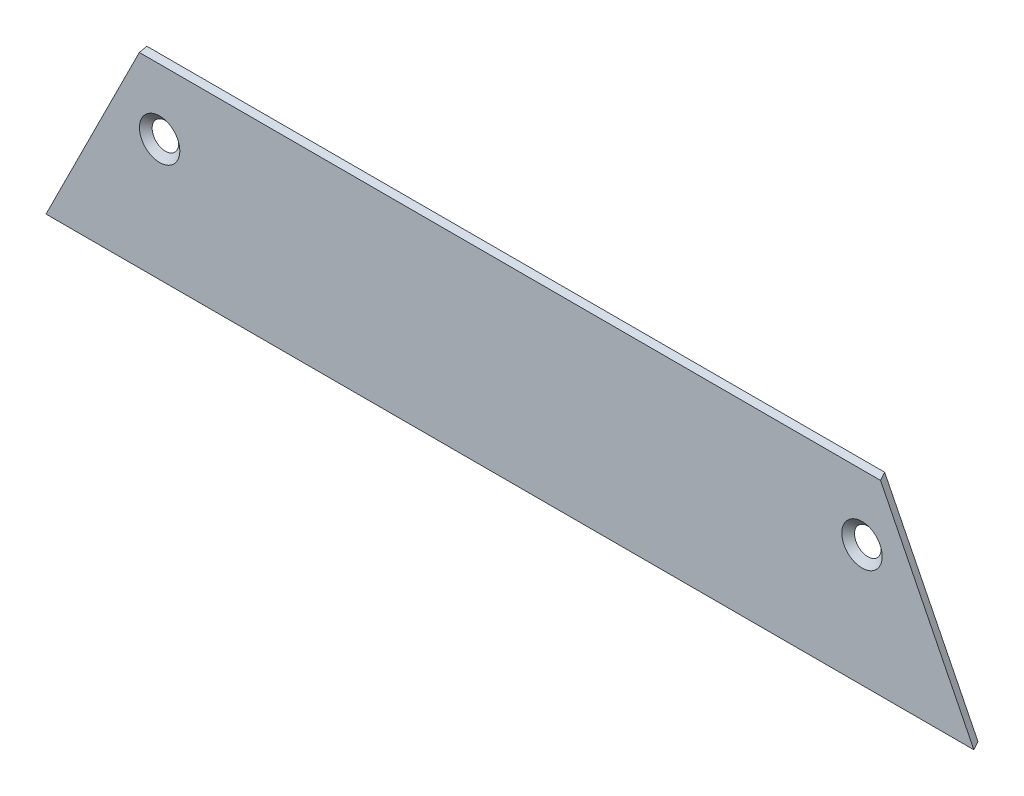
ISO-10303-21;
HEADER;
FILE_DESCRIPTION(('STEP AP214'),'2;1');
FILE_NAME('part.step','',(''),(''),'','','');
FILE_SCHEMA(('AUTOMOTIVE_DESIGN { 1 0 10303 214 1 1 1 1 }'));
ENDSEC;
DATA;
#1=APPLICATION_CONTEXT('core data for automotive mechanical design processes');
#2=APPLICATION_PROTOCOL_DEFINITION('international standard','automotive_design',2000,#1);
#3=PRODUCT_CONTEXT('',#1,'mechanical');
#4=PRODUCT('Part','Part','',(#3));
#5=PRODUCT_RELATED_PRODUCT_CATEGORY('part','',(#4));
#6=PRODUCT_DEFINITION_FORMATION('','',#4);
#7=PRODUCT_DEFINITION_CONTEXT('part definition',#1,'design');
#8=PRODUCT_DEFINITION('design','',#6,#7);
#9=PRODUCT_DEFINITION_SHAPE('','',#8);
#10=(LENGTH_UNIT() NAMED_UNIT(*) SI_UNIT(.MILLI.,.METRE.));
#11=(NAMED_UNIT(*) PLANE_ANGLE_UNIT() SI_UNIT($,.RADIAN.));
#12=(NAMED_UNIT(*) SI_UNIT($,.STERADIAN.) SOLID_ANGLE_UNIT());
#13=UNCERTAINTY_MEASURE_WITH_UNIT(LENGTH_MEASURE(1.E-05),#10,'distance_accuracy_value','');
#14=(GEOMETRIC_REPRESENTATION_CONTEXT(3) GLOBAL_UNCERTAINTY_ASSIGNED_CONTEXT((#13)) GLOBAL_UNIT_ASSIGNED_CONTEXT((#10,
#11,#12)) REPRESENTATION_CONTEXT('',''));
#15=CARTESIAN_POINT('',(0.,0.,0.));
#16=DIRECTION('',(0.,0.,1.));
#17=DIRECTION('',(1.,0.,0.));
#18=AXIS2_PLACEMENT_3D('',#15,#16,#17);
#19=CARTESIAN_POINT('',(162.814,-1.33086780534522,0.5715));
#20=DIRECTION('',(0.,0.,1.));
#21=DIRECTION('',(1.,0.,0.));
#22=AXIS2_PLACEMENT_3D('',#19,#20,#21);
#23=PLANE('',#22);
#24=CARTESIAN_POINT('',(19.9389999999997,19.426957216481,0.5715));
#25=DIRECTION('',(0.,0.,1.));
#26=DIRECTION('',(1.,0.,0.));
#27=AXIS2_PLACEMENT_3D('',#24,#25,#26);
#28=CIRCLE('',#27,2.33247834992428);
#29=CARTESIAN_POINT('',(22.271478349924,19.426957216481,0.5715));
#30=VERTEX_POINT('',#29);
#31=EDGE_CURVE('E114',#30,#30,#28,.T.);
#32=ORIENTED_EDGE('',*,*,#31,.T.);
#33=EDGE_LOOP('',(#32));
#34=FACE_BOUND('',#33,.T.);
#35=CARTESIAN_POINT('',(143.187406325167,19.426957216481,0.5715));
#36=DIRECTION('',(0.,0.,1.));
#37=DIRECTION('',(1.,0.,0.));
#38=AXIS2_PLACEMENT_3D('',#35,#36,#37);
#39=CIRCLE('',#38,2.33247834992428);
#40=CARTESIAN_POINT('',(145.519884675091,19.426957216481,0.5715));
#41=VERTEX_POINT('',#40);
#42=EDGE_CURVE('E107',#41,#41,#39,.T.);
#43=ORIENTED_EDGE('',*,*,#42,.T.);
#44=EDGE_LOOP('',(#43));
#45=FACE_BOUND('',#44,.T.);
#46=DIRECTION('',(-1.,0.,0.));
#47=VECTOR('',#46,1.);
#48=CARTESIAN_POINT('',(162.814,31.4200443211581,0.5715));
#49=LINE('',#48,#47);
#50=CARTESIAN_POINT('',(146.141650509094,31.4200443211581,0.5715));
#51=VERTEX_POINT('',#50);
#52=CARTESIAN_POINT('',(16.6723494909062,31.4200443211581,0.5715));
#53=VERTEX_POINT('',#52);
#54=EDGE_CURVE('E11',#51,#53,#49,.T.);
#55=ORIENTED_EDGE('',*,*,#54,.F.);
#56=DIRECTION('',(0.447290848418704,-0.894388560370086,0.));
#57=VECTOR('',#56,1.);
#58=CARTESIAN_POINT('',(162.814,-1.91745567884188,0.5715));
#59=LINE('',#58,#57);
#60=CARTESIAN_POINT('',(162.520642728637,-1.33086780534522,0.5715));
#61=VERTEX_POINT('',#60);
#62=EDGE_CURVE('E70',#51,#61,#59,.T.);
#63=ORIENTED_EDGE('',*,*,#62,.T.);
#64=DIRECTION('',(-1.,0.,0.));
#65=VECTOR('',#64,1.);
#66=CARTESIAN_POINT('',(162.814,-1.33086780534522,0.5715));
#67=LINE('',#66,#65);
#68=CARTESIAN_POINT('',(0.293357271362982,-1.33086780534522,0.5715));
#69=VERTEX_POINT('',#68);
#70=EDGE_CURVE('E46',#61,#69,#67,.T.);
#71=ORIENTED_EDGE('',*,*,#70,.T.);
#72=DIRECTION('',(0.447290848418704,0.894388560370086,0.));
#73=VECTOR('',#72,1.);
#74=CARTESIAN_POINT('',(0.,-1.91745567884188,0.5715));
#75=LINE('',#74,#73);
#76=EDGE_CURVE('E84',#69,#53,#75,.T.);
#77=ORIENTED_EDGE('',*,*,#76,.T.);
#78=EDGE_LOOP('',(#55,#63,#71,#77));
#79=FACE_BOUND('',#78,.T.);
#80=ADVANCED_FACE('F32',(#34,#45,#79),#23,.F.);
#81=CARTESIAN_POINT('',(162.814,31.4200443211581,0.5715));
#82=DIRECTION('',(0.,-0.866025403784435,-0.500000000000006));
#83=DIRECTION('',(0.,0.500000000000006,-0.866025403784435));
#84=AXIS2_PLACEMENT_3D('',#81,#82,#83);
#85=PLANE('',#84);
#86=DIRECTION('',(-1.,0.,0.));
#87=VECTOR('',#86,1.);
#88=CARTESIAN_POINT('',(162.814,30.8334564476615,1.5875));
#89=LINE('',#88,#87);
#90=CARTESIAN_POINT('',(146.435007780457,30.8334564476614,1.5875));
#91=VERTEX_POINT('',#90);
#92=CARTESIAN_POINT('',(16.3789922195432,30.8334564476615,1.5875));
#93=VERTEX_POINT('',#92);
#94=EDGE_CURVE('E39',#91,#93,#89,.T.);
#95=ORIENTED_EDGE('',*,*,#94,.F.);
#96=DIRECTION('',(-0.242584917028732,0.485065087908362,-0.840157377235133));
#97=VECTOR('',#96,1.);
#98=CARTESIAN_POINT('',(147.122775628261,29.4582177244887,3.96948334107133));
#99=LINE('',#98,#97);
#100=EDGE_CURVE('E73',#91,#51,#99,.T.);
#101=ORIENTED_EDGE('',*,*,#100,.T.);
#102=ORIENTED_EDGE('',*,*,#54,.T.);
#103=DIRECTION('',(-0.242584917028732,-0.485065087908362,0.840157377235133));
#104=VECTOR('',#103,1.);
#105=CARTESIAN_POINT('',(25.2724117886163,48.6164554812222,-29.213557837075));
#106=LINE('',#105,#104);
#107=EDGE_CURVE('E89',#53,#93,#106,.T.);
#108=ORIENTED_EDGE('',*,*,#107,.T.);
#109=EDGE_LOOP('',(#95,#101,#102,#108));
#110=FACE_BOUND('',#109,.T.);
#111=ADVANCED_FACE('F79',(#110),#85,.F.);
#112=CARTESIAN_POINT('',(162.814,-1.91745567884188,1.5875));
#113=DIRECTION('',(0.,0.,-1.));
#114=DIRECTION('',(0.,1.,0.));
#115=AXIS2_PLACEMENT_3D('',#112,#113,#114);
#116=PLANE('',#115);
#117=CARTESIAN_POINT('',(19.9389999999997,19.426957216481,1.5875));
#118=DIRECTION('',(0.,0.,1.));
#119=DIRECTION('',(1.,0.,0.));
#120=AXIS2_PLACEMENT_3D('',#117,#118,#119);
#121=CIRCLE('',#120,3.5433);
#122=CARTESIAN_POINT('',(23.4822999999997,19.426957216481,1.5875));
#123=VERTEX_POINT('',#122);
#124=EDGE_CURVE('E117',#123,#123,#121,.T.);
#125=ORIENTED_EDGE('',*,*,#124,.F.);
#126=EDGE_LOOP('',(#125));
#127=FACE_BOUND('',#126,.T.);
#128=CARTESIAN_POINT('',(143.187406325167,19.426957216481,1.5875));
#129=DIRECTION('',(0.,0.,1.));
#130=DIRECTION('',(1.,0.,0.));
#131=AXIS2_PLACEMENT_3D('',#128,#129,#130);
#132=CIRCLE('',#131,3.5433);
#133=CARTESIAN_POINT('',(146.730706325167,19.426957216481,1.5875));
#134=VERTEX_POINT('',#133);
#135=EDGE_CURVE('E111',#134,#134,#132,.T.);
#136=ORIENTED_EDGE('',*,*,#135,.F.);
#137=EDGE_LOOP('',(#136));
#138=FACE_BOUND('',#137,.T.);
#139=DIRECTION('',(-1.,0.,0.));
#140=VECTOR('',#139,1.);
#141=CARTESIAN_POINT('',(162.814,-1.91745567884188,1.5875));
#142=LINE('',#141,#140);
#143=CARTESIAN_POINT('',(162.814,-1.91745567884188,1.5875));
#144=VERTEX_POINT('',#143);
#145=CARTESIAN_POINT('',(0.,-1.91745567884188,1.5875));
#146=VERTEX_POINT('',#145);
#147=EDGE_CURVE('E97',#144,#146,#142,.T.);
#148=ORIENTED_EDGE('',*,*,#147,.F.);
#149=DIRECTION('',(0.447290848418704,-0.894388560370086,0.));
#150=VECTOR('',#149,1.);
#151=CARTESIAN_POINT('',(162.814,-1.91745567884188,1.5875));
#152=LINE('',#151,#150);
#153=EDGE_CURVE('E54',#91,#144,#152,.T.);
#154=ORIENTED_EDGE('',*,*,#153,.F.);
#155=ORIENTED_EDGE('',*,*,#94,.T.);
#156=DIRECTION('',(0.447290848418704,0.894388560370086,0.));
#157=VECTOR('',#156,1.);
#158=CARTESIAN_POINT('',(0.,-1.91745567884188,1.5875));
#159=LINE('',#158,#157);
#160=EDGE_CURVE('E82',#146,#93,#159,.T.);
#161=ORIENTED_EDGE('',*,*,#160,.F.);
#162=EDGE_LOOP('',(#148,#154,#155,#161));
#163=FACE_BOUND('',#162,.T.);
#164=ADVANCED_FACE('F102',(#127,#138,#163),#116,.F.);
#165=CARTESIAN_POINT('',(162.814,-1.91745567884188,1.5875));
#166=DIRECTION('',(0.,0.86602540378444,0.499999999999998));
#167=DIRECTION('',(0.,-0.499999999999998,0.86602540378444));
#168=AXIS2_PLACEMENT_3D('',#165,#166,#167);
#169=PLANE('',#168);
#170=ORIENTED_EDGE('',*,*,#70,.F.);
#171=DIRECTION('',(0.242584917028728,-0.485065087908354,0.840157377235138));
#172=VECTOR('',#171,1.);
#173=CARTESIAN_POINT('',(162.814,-1.91745567884188,1.5875));
#174=LINE('',#173,#172);
#175=EDGE_CURVE('E74',#61,#144,#174,.T.);
#176=ORIENTED_EDGE('',*,*,#175,.T.);
#177=ORIENTED_EDGE('',*,*,#147,.T.);
#178=DIRECTION('',(0.242584917028728,0.485065087908354,-0.840157377235138));
#179=VECTOR('',#178,1.);
#180=CARTESIAN_POINT('',(9.58118741687672,17.2407820778911,-31.5955411781461));
#181=LINE('',#180,#179);
#182=EDGE_CURVE('E87',#146,#69,#181,.T.);
#183=ORIENTED_EDGE('',*,*,#182,.T.);
#184=EDGE_LOOP('',(#170,#176,#177,#183));
#185=FACE_BOUND('',#184,.T.);
#186=ADVANCED_FACE('F105',(#185),#169,.F.);
#187=CARTESIAN_POINT('',(0.,-1.91745567884188,0.5715));
#188=DIRECTION('',(0.894388560370086,-0.447290848418704,0.));
#189=DIRECTION('',(0.447290848418704,0.894388560370086,0.));
#190=AXIS2_PLACEMENT_3D('',#187,#188,#189);
#191=PLANE('',#190);
#192=ORIENTED_EDGE('',*,*,#76,.F.);
#193=ORIENTED_EDGE('',*,*,#182,.F.);
#194=ORIENTED_EDGE('',*,*,#160,.T.);
#195=ORIENTED_EDGE('',*,*,#107,.F.);
#196=EDGE_LOOP('',(#192,#193,#194,#195));
#197=FACE_BOUND('',#196,.T.);
#198=ADVANCED_FACE('F103',(#197),#191,.F.);
#199=CARTESIAN_POINT('',(162.814,-1.91745567884188,0.5715));
#200=DIRECTION('',(-0.894388560370087,-0.447290848418704,0.));
#201=DIRECTION('',(0.447290848418704,-0.894388560370087,0.));
#202=AXIS2_PLACEMENT_3D('',#199,#200,#201);
#203=PLANE('',#202);
#204=ORIENTED_EDGE('',*,*,#153,.T.);
#205=ORIENTED_EDGE('',*,*,#175,.F.);
#206=ORIENTED_EDGE('',*,*,#62,.F.);
#207=ORIENTED_EDGE('',*,*,#100,.F.);
#208=EDGE_LOOP('',(#204,#205,#206,#207));
#209=FACE_BOUND('',#208,.T.);
#210=ADVANCED_FACE('F72',(#209),#203,.F.);
#211=CARTESIAN_POINT('',(143.187406325167,19.426957216481,1.5875));
#212=DIRECTION('',(0.,0.,1.));
#213=DIRECTION('',(1.,0.,0.));
#214=AXIS2_PLACEMENT_3D('',#211,#212,#213);
#215=CONICAL_SURFACE('',#214,3.5433,0.872664625997163);
#216=ORIENTED_EDGE('',*,*,#135,.T.);
#217=EDGE_LOOP('',(#216));
#218=FACE_BOUND('',#217,.T.);
#219=ORIENTED_EDGE('',*,*,#42,.F.);
#220=EDGE_LOOP('',(#219));
#221=FACE_BOUND('',#220,.T.);
#222=ADVANCED_FACE('F129',(#218,#221),#215,.F.);
#223=CARTESIAN_POINT('',(19.9389999999997,19.426957216481,1.5875));
#224=DIRECTION('',(0.,0.,1.));
#225=DIRECTION('',(1.,0.,0.));
#226=AXIS2_PLACEMENT_3D('',#223,#224,#225);
#227=CONICAL_SURFACE('',#226,3.5433,0.872664625997164);
#228=ORIENTED_EDGE('',*,*,#124,.T.);
#229=EDGE_LOOP('',(#228));
#230=FACE_BOUND('',#229,.T.);
#231=ORIENTED_EDGE('',*,*,#31,.F.);
#232=EDGE_LOOP('',(#231));
#233=FACE_BOUND('',#232,.T.);
#234=ADVANCED_FACE('F121',(#230,#233),#227,.F.);
#235=CLOSED_SHELL('',(#80,#111,#164,#186,#198,#210,#222,#234));
#236=MANIFOLD_SOLID_BREP('B2',#235);
#237=ADVANCED_BREP_SHAPE_REPRESENTATION('',(#18,#236),#14);
#238=SHAPE_DEFINITION_REPRESENTATION(#9,#237);
ENDSEC;
END-ISO-10303-21;
